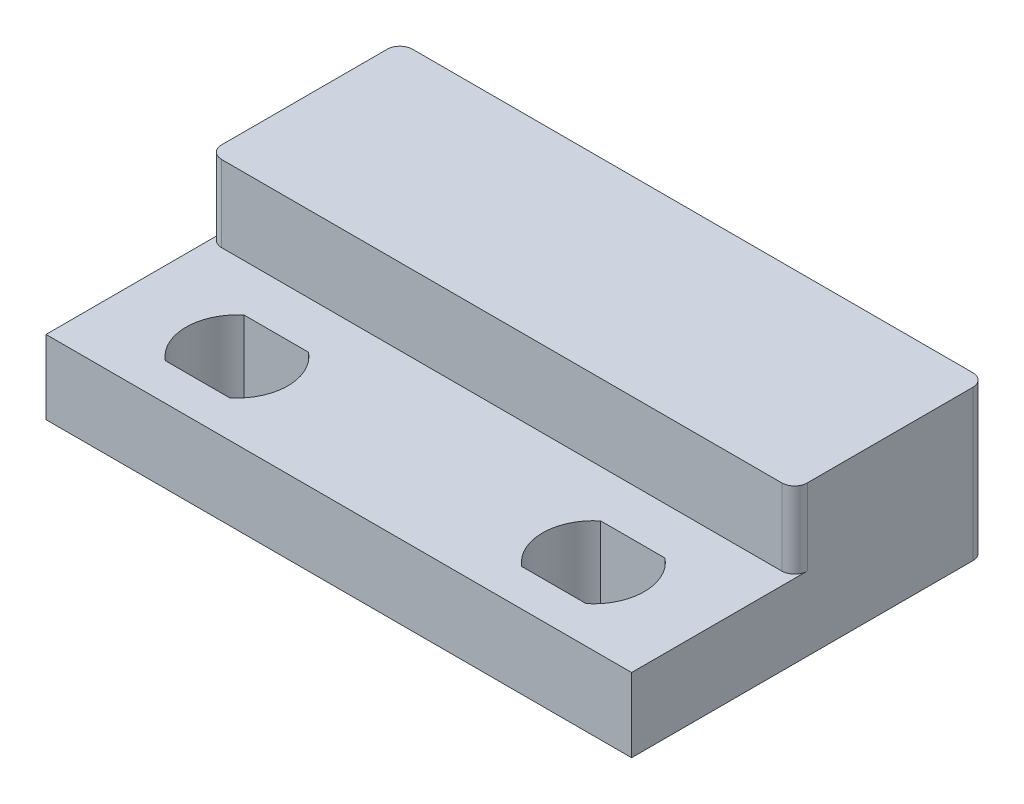
ISO-10303-21;
HEADER;
FILE_DESCRIPTION(('STEP AP214'),'2;1');
FILE_NAME('part.step','',(''),(''),'','','');
FILE_SCHEMA(('AUTOMOTIVE_DESIGN { 1 0 10303 214 1 1 1 1 }'));
ENDSEC;
DATA;
#1=APPLICATION_CONTEXT('core data for automotive mechanical design processes');
#2=APPLICATION_PROTOCOL_DEFINITION('international standard','automotive_design',2000,#1);
#3=PRODUCT_CONTEXT('',#1,'mechanical');
#4=PRODUCT('Part','Part','',(#3));
#5=PRODUCT_RELATED_PRODUCT_CATEGORY('part','',(#4));
#6=PRODUCT_DEFINITION_FORMATION('','',#4);
#7=PRODUCT_DEFINITION_CONTEXT('part definition',#1,'design');
#8=PRODUCT_DEFINITION('design','',#6,#7);
#9=PRODUCT_DEFINITION_SHAPE('','',#8);
#10=(LENGTH_UNIT() NAMED_UNIT(*) SI_UNIT(.MILLI.,.METRE.));
#11=(NAMED_UNIT(*) PLANE_ANGLE_UNIT() SI_UNIT($,.RADIAN.));
#12=(NAMED_UNIT(*) SI_UNIT($,.STERADIAN.) SOLID_ANGLE_UNIT());
#13=UNCERTAINTY_MEASURE_WITH_UNIT(LENGTH_MEASURE(1.E-05),#10,'distance_accuracy_value','');
#14=(GEOMETRIC_REPRESENTATION_CONTEXT(3) GLOBAL_UNCERTAINTY_ASSIGNED_CONTEXT((#13)) GLOBAL_UNIT_ASSIGNED_CONTEXT((#10,
#11,#12)) REPRESENTATION_CONTEXT('',''));
#15=CARTESIAN_POINT('',(0.,0.,0.));
#16=DIRECTION('',(0.,0.,1.));
#17=DIRECTION('',(1.,0.,0.));
#18=AXIS2_PLACEMENT_3D('',#15,#16,#17);
#19=CARTESIAN_POINT('',(11.5,1.45,10.15));
#20=DIRECTION('',(0.,0.,-1.));
#21=DIRECTION('',(-1.,0.,0.));
#22=AXIS2_PLACEMENT_3D('',#19,#20,#21);
#23=PLANE('',#22);
#24=DIRECTION('',(0.,-1.,0.));
#25=VECTOR('',#24,1.);
#26=CARTESIAN_POINT('',(-11.5,1.45,10.15));
#27=LINE('',#26,#25);
#28=CARTESIAN_POINT('',(-11.5,1.45,10.15));
#29=VERTEX_POINT('',#28);
#30=CARTESIAN_POINT('',(-11.5,-1.45,10.15));
#31=VERTEX_POINT('',#30);
#32=EDGE_CURVE('E215',#29,#31,#27,.T.);
#33=ORIENTED_EDGE('',*,*,#32,.T.);
#34=DIRECTION('',(-1.,0.,0.));
#35=VECTOR('',#34,1.);
#36=CARTESIAN_POINT('',(11.5,-1.45,10.15));
#37=LINE('',#36,#35);
#38=CARTESIAN_POINT('',(11.5,-1.45,10.15));
#39=VERTEX_POINT('',#38);
#40=EDGE_CURVE('E312',#39,#31,#37,.T.);
#41=ORIENTED_EDGE('',*,*,#40,.F.);
#42=DIRECTION('',(0.,-1.,0.));
#43=VECTOR('',#42,1.);
#44=CARTESIAN_POINT('',(11.5,1.45,10.15));
#45=LINE('',#44,#43);
#46=CARTESIAN_POINT('',(11.5,1.45,10.15));
#47=VERTEX_POINT('',#46);
#48=EDGE_CURVE('E264',#47,#39,#45,.T.);
#49=ORIENTED_EDGE('',*,*,#48,.F.);
#50=DIRECTION('',(-1.,0.,0.));
#51=VECTOR('',#50,1.);
#52=CARTESIAN_POINT('',(11.5,1.45,10.15));
#53=LINE('',#52,#51);
#54=EDGE_CURVE('E279',#47,#29,#53,.T.);
#55=ORIENTED_EDGE('',*,*,#54,.T.);
#56=EDGE_LOOP('',(#33,#41,#49,#55));
#57=FACE_BOUND('',#56,.T.);
#58=ADVANCED_FACE('F39',(#57),#23,.F.);
#59=CARTESIAN_POINT('',(11.5,-1.45,10.15));
#60=DIRECTION('',(0.,1.,0.));
#61=DIRECTION('',(0.,0.,1.));
#62=AXIS2_PLACEMENT_3D('',#59,#60,#61);
#63=PLANE('',#62);
#64=DIRECTION('',(1.,0.,0.));
#65=VECTOR('',#64,1.);
#66=CARTESIAN_POINT('',(-8.26392246597645,-1.45,8.7));
#67=LINE('',#66,#65);
#68=CARTESIAN_POINT('',(-8.26392246597645,-1.45,8.7));
#69=VERTEX_POINT('',#68);
#70=CARTESIAN_POINT('',(-5.73607753402354,-1.45,8.7));
#71=VERTEX_POINT('',#70);
#72=EDGE_CURVE('E177',#69,#71,#67,.T.);
#73=ORIENTED_EDGE('',*,*,#72,.T.);
#74=CARTESIAN_POINT('',(-7.,-1.45,7.15));
#75=DIRECTION('',(0.,1.,0.));
#76=DIRECTION('',(0.,0.,1.));
#77=AXIS2_PLACEMENT_3D('',#74,#75,#76);
#78=CIRCLE('',#77,2.);
#79=CARTESIAN_POINT('',(-5.73607753402355,-1.45,5.6));
#80=VERTEX_POINT('',#79);
#81=EDGE_CURVE('E168',#71,#80,#78,.T.);
#82=ORIENTED_EDGE('',*,*,#81,.T.);
#83=DIRECTION('',(-1.,0.,0.));
#84=VECTOR('',#83,1.);
#85=CARTESIAN_POINT('',(-8.26392246597645,-1.45,5.6));
#86=LINE('',#85,#84);
#87=CARTESIAN_POINT('',(-8.26392246597645,-1.45,5.6));
#88=VERTEX_POINT('',#87);
#89=EDGE_CURVE('E181',#80,#88,#86,.T.);
#90=ORIENTED_EDGE('',*,*,#89,.T.);
#91=CARTESIAN_POINT('',(-7.,-1.45,7.15));
#92=DIRECTION('',(0.,1.,0.));
#93=DIRECTION('',(0.,0.,1.));
#94=AXIS2_PLACEMENT_3D('',#91,#92,#93);
#95=CIRCLE('',#94,2.);
#96=EDGE_CURVE('E186',#88,#69,#95,.T.);
#97=ORIENTED_EDGE('',*,*,#96,.T.);
#98=EDGE_LOOP('',(#73,#82,#90,#97));
#99=FACE_BOUND('',#98,.T.);
#100=DIRECTION('',(1.,0.,0.));
#101=VECTOR('',#100,1.);
#102=CARTESIAN_POINT('',(5.73607753402355,-1.45,8.7));
#103=LINE('',#102,#101);
#104=CARTESIAN_POINT('',(5.73607753402355,-1.45,8.7));
#105=VERTEX_POINT('',#104);
#106=CARTESIAN_POINT('',(8.26392246597645,-1.45,8.7));
#107=VERTEX_POINT('',#106);
#108=EDGE_CURVE('E234',#105,#107,#103,.T.);
#109=ORIENTED_EDGE('',*,*,#108,.T.);
#110=CARTESIAN_POINT('',(7.,-1.45,7.15));
#111=DIRECTION('',(0.,1.,0.));
#112=DIRECTION('',(0.,0.,1.));
#113=AXIS2_PLACEMENT_3D('',#110,#111,#112);
#114=CIRCLE('',#113,2.);
#115=CARTESIAN_POINT('',(8.26392246597645,-1.45,5.6));
#116=VERTEX_POINT('',#115);
#117=EDGE_CURVE('E221',#107,#116,#114,.T.);
#118=ORIENTED_EDGE('',*,*,#117,.T.);
#119=DIRECTION('',(-1.,0.,0.));
#120=VECTOR('',#119,1.);
#121=CARTESIAN_POINT('',(5.73607753402355,-1.45,5.6));
#122=LINE('',#121,#120);
#123=CARTESIAN_POINT('',(5.73607753402355,-1.45,5.6));
#124=VERTEX_POINT('',#123);
#125=EDGE_CURVE('E225',#116,#124,#122,.T.);
#126=ORIENTED_EDGE('',*,*,#125,.T.);
#127=CARTESIAN_POINT('',(7.,-1.45,7.15));
#128=DIRECTION('',(0.,1.,0.));
#129=DIRECTION('',(0.,0.,1.));
#130=AXIS2_PLACEMENT_3D('',#127,#128,#129);
#131=CIRCLE('',#130,2.);
#132=EDGE_CURVE('E230',#124,#105,#131,.T.);
#133=ORIENTED_EDGE('',*,*,#132,.T.);
#134=EDGE_LOOP('',(#109,#118,#126,#133));
#135=FACE_BOUND('',#134,.T.);
#136=DIRECTION('',(-1.,0.,0.));
#137=VECTOR('',#136,1.);
#138=CARTESIAN_POINT('',(11.5,-1.45,-3.75));
#139=LINE('',#138,#137);
#140=CARTESIAN_POINT('',(11.,-1.45,-3.75));
#141=VERTEX_POINT('',#140);
#142=CARTESIAN_POINT('',(-11.,-1.45,-3.75));
#143=VERTEX_POINT('',#142);
#144=EDGE_CURVE('E308',#141,#143,#139,.T.);
#145=ORIENTED_EDGE('',*,*,#144,.F.);
#146=CARTESIAN_POINT('',(11.,-1.45,-3.25));
#147=DIRECTION('',(0.,1.,0.));
#148=DIRECTION('',(0.,0.,1.));
#149=AXIS2_PLACEMENT_3D('',#146,#147,#148);
#150=CIRCLE('',#149,0.5);
#151=CARTESIAN_POINT('',(11.5,-1.45,-3.25));
#152=VERTEX_POINT('',#151);
#153=EDGE_CURVE('E346',#141,#152,#150,.F.);
#154=ORIENTED_EDGE('',*,*,#153,.T.);
#155=DIRECTION('',(0.,0.,-1.));
#156=VECTOR('',#155,1.);
#157=CARTESIAN_POINT('',(11.5,-1.45,10.15));
#158=LINE('',#157,#156);
#159=EDGE_CURVE('E268',#39,#152,#158,.T.);
#160=ORIENTED_EDGE('',*,*,#159,.F.);
#161=ORIENTED_EDGE('',*,*,#40,.T.);
#162=DIRECTION('',(0.,0.,-1.));
#163=VECTOR('',#162,1.);
#164=CARTESIAN_POINT('',(-11.5,-1.45,10.15));
#165=LINE('',#164,#163);
#166=CARTESIAN_POINT('',(-11.5,-1.45,-3.25));
#167=VERTEX_POINT('',#166);
#168=EDGE_CURVE('E283',#31,#167,#165,.T.);
#169=ORIENTED_EDGE('',*,*,#168,.T.);
#170=CARTESIAN_POINT('',(-11.,-1.45,-3.25));
#171=DIRECTION('',(0.,1.,0.));
#172=DIRECTION('',(0.,0.,1.));
#173=AXIS2_PLACEMENT_3D('',#170,#171,#172);
#174=CIRCLE('',#173,0.5);
#175=EDGE_CURVE('E343',#167,#143,#174,.F.);
#176=ORIENTED_EDGE('',*,*,#175,.T.);
#177=EDGE_LOOP('',(#145,#154,#160,#161,#169,#176));
#178=FACE_BOUND('',#177,.T.);
#179=ADVANCED_FACE('F188',(#99,#135,#178),#63,.F.);
#180=CARTESIAN_POINT('',(11.5,-1.45,-3.75));
#181=DIRECTION('',(0.,0.,1.));
#182=DIRECTION('',(1.,0.,0.));
#183=AXIS2_PLACEMENT_3D('',#180,#181,#182);
#184=PLANE('',#183);
#185=DIRECTION('',(-1.,0.,0.));
#186=VECTOR('',#185,1.);
#187=CARTESIAN_POINT('',(11.5,4.45,-3.75));
#188=LINE('',#187,#186);
#189=CARTESIAN_POINT('',(11.,4.45,-3.75));
#190=VERTEX_POINT('',#189);
#191=CARTESIAN_POINT('',(-11.,4.45,-3.75));
#192=VERTEX_POINT('',#191);
#193=EDGE_CURVE('E304',#190,#192,#188,.T.);
#194=ORIENTED_EDGE('',*,*,#193,.F.);
#195=DIRECTION('',(0.,1.,0.));
#196=VECTOR('',#195,1.);
#197=CARTESIAN_POINT('',(11.,-1.45,-3.75));
#198=LINE('',#197,#196);
#199=EDGE_CURVE('E340',#190,#141,#198,.F.);
#200=ORIENTED_EDGE('',*,*,#199,.T.);
#201=ORIENTED_EDGE('',*,*,#144,.T.);
#202=DIRECTION('',(0.,1.,0.));
#203=VECTOR('',#202,1.);
#204=CARTESIAN_POINT('',(-11.,-1.45,-3.75));
#205=LINE('',#204,#203);
#206=EDGE_CURVE('E336',#143,#192,#205,.T.);
#207=ORIENTED_EDGE('',*,*,#206,.T.);
#208=EDGE_LOOP('',(#194,#200,#201,#207));
#209=FACE_BOUND('',#208,.T.);
#210=ADVANCED_FACE('F386',(#209),#184,.F.);
#211=CARTESIAN_POINT('',(11.5,4.45,-3.75));
#212=DIRECTION('',(0.,-1.,0.));
#213=DIRECTION('',(0.,0.,-1.));
#214=AXIS2_PLACEMENT_3D('',#211,#212,#213);
#215=PLANE('',#214);
#216=DIRECTION('',(0.,0.,1.));
#217=VECTOR('',#216,1.);
#218=CARTESIAN_POINT('',(11.5,4.45,-3.75));
#219=LINE('',#218,#217);
#220=CARTESIAN_POINT('',(11.5,4.45,-3.25));
#221=VERTEX_POINT('',#220);
#222=CARTESIAN_POINT('',(11.5,4.45,3.25));
#223=VERTEX_POINT('',#222);
#224=EDGE_CURVE('E272',#221,#223,#219,.T.);
#225=ORIENTED_EDGE('',*,*,#224,.F.);
#226=CARTESIAN_POINT('',(11.,4.45,-3.25));
#227=DIRECTION('',(0.,-1.,0.));
#228=DIRECTION('',(0.,0.,-1.));
#229=AXIS2_PLACEMENT_3D('',#226,#227,#228);
#230=CIRCLE('',#229,0.5);
#231=EDGE_CURVE('E333',#221,#190,#230,.F.);
#232=ORIENTED_EDGE('',*,*,#231,.T.);
#233=ORIENTED_EDGE('',*,*,#193,.T.);
#234=CARTESIAN_POINT('',(-11.,4.45,-3.25));
#235=DIRECTION('',(0.,-1.,0.));
#236=DIRECTION('',(0.,0.,-1.));
#237=AXIS2_PLACEMENT_3D('',#234,#235,#236);
#238=CIRCLE('',#237,0.5);
#239=CARTESIAN_POINT('',(-11.5,4.45,-3.25));
#240=VERTEX_POINT('',#239);
#241=EDGE_CURVE('E327',#192,#240,#238,.F.);
#242=ORIENTED_EDGE('',*,*,#241,.T.);
#243=DIRECTION('',(0.,0.,1.));
#244=VECTOR('',#243,1.);
#245=CARTESIAN_POINT('',(-11.5,4.45,-3.75));
#246=LINE('',#245,#244);
#247=CARTESIAN_POINT('',(-11.5,4.45,3.25));
#248=VERTEX_POINT('',#247);
#249=EDGE_CURVE('E287',#240,#248,#246,.T.);
#250=ORIENTED_EDGE('',*,*,#249,.T.);
#251=CARTESIAN_POINT('',(-11.,4.45,3.25));
#252=DIRECTION('',(0.,-1.,0.));
#253=DIRECTION('',(0.,0.,-1.));
#254=AXIS2_PLACEMENT_3D('',#251,#252,#253);
#255=CIRCLE('',#254,0.5);
#256=CARTESIAN_POINT('',(-11.,4.45,3.75));
#257=VERTEX_POINT('',#256);
#258=EDGE_CURVE('E324',#248,#257,#255,.F.);
#259=ORIENTED_EDGE('',*,*,#258,.T.);
#260=DIRECTION('',(-1.,0.,0.));
#261=VECTOR('',#260,1.);
#262=CARTESIAN_POINT('',(11.5,4.45,3.75));
#263=LINE('',#262,#261);
#264=CARTESIAN_POINT('',(11.,4.45,3.75));
#265=VERTEX_POINT('',#264);
#266=EDGE_CURVE('E300',#265,#257,#263,.T.);
#267=ORIENTED_EDGE('',*,*,#266,.F.);
#268=CARTESIAN_POINT('',(11.,4.45,3.25));
#269=DIRECTION('',(0.,-1.,0.));
#270=DIRECTION('',(0.,0.,-1.));
#271=AXIS2_PLACEMENT_3D('',#268,#269,#270);
#272=CIRCLE('',#271,0.5);
#273=EDGE_CURVE('E330',#265,#223,#272,.F.);
#274=ORIENTED_EDGE('',*,*,#273,.T.);
#275=EDGE_LOOP('',(#225,#232,#233,#242,#250,#259,#267,#274));
#276=FACE_BOUND('',#275,.T.);
#277=ADVANCED_FACE('F376',(#276),#215,.F.);
#278=CARTESIAN_POINT('',(11.5,4.45,3.75));
#279=DIRECTION('',(0.,0.,-1.));
#280=DIRECTION('',(-1.,0.,0.));
#281=AXIS2_PLACEMENT_3D('',#278,#279,#280);
#282=PLANE('',#281);
#283=DIRECTION('',(-1.,0.,0.));
#284=VECTOR('',#283,1.);
#285=CARTESIAN_POINT('',(11.5,1.45,3.75));
#286=LINE('',#285,#284);
#287=CARTESIAN_POINT('',(11.,1.45,3.75));
#288=VERTEX_POINT('',#287);
#289=CARTESIAN_POINT('',(-11.,1.45,3.75));
#290=VERTEX_POINT('',#289);
#291=EDGE_CURVE('E296',#288,#290,#286,.T.);
#292=ORIENTED_EDGE('',*,*,#291,.F.);
#293=DIRECTION('',(0.,-1.,0.));
#294=VECTOR('',#293,1.);
#295=CARTESIAN_POINT('',(11.,4.45,3.75));
#296=LINE('',#295,#294);
#297=EDGE_CURVE('E352',#288,#265,#296,.F.);
#298=ORIENTED_EDGE('',*,*,#297,.T.);
#299=ORIENTED_EDGE('',*,*,#266,.T.);
#300=DIRECTION('',(0.,-1.,0.));
#301=VECTOR('',#300,1.);
#302=CARTESIAN_POINT('',(-11.,4.45,3.75));
#303=LINE('',#302,#301);
#304=EDGE_CURVE('E349',#257,#290,#303,.T.);
#305=ORIENTED_EDGE('',*,*,#304,.T.);
#306=EDGE_LOOP('',(#292,#298,#299,#305));
#307=FACE_BOUND('',#306,.T.);
#308=ADVANCED_FACE('F370',(#307),#282,.F.);
#309=CARTESIAN_POINT('',(11.5,1.45,3.75));
#310=DIRECTION('',(0.,-1.,0.));
#311=DIRECTION('',(0.,0.,-1.));
#312=AXIS2_PLACEMENT_3D('',#309,#310,#311);
#313=PLANE('',#312);
#314=DIRECTION('',(-1.,0.,0.));
#315=VECTOR('',#314,1.);
#316=CARTESIAN_POINT('',(-8.26392246597645,1.45,5.6));
#317=LINE('',#316,#315);
#318=CARTESIAN_POINT('',(-5.73607753402355,1.45,5.6));
#319=VERTEX_POINT('',#318);
#320=CARTESIAN_POINT('',(-8.26392246597645,1.45,5.6));
#321=VERTEX_POINT('',#320);
#322=EDGE_CURVE('E205',#319,#321,#317,.T.);
#323=ORIENTED_EDGE('',*,*,#322,.F.);
#324=CARTESIAN_POINT('',(-7.,1.45,7.15));
#325=DIRECTION('',(0.,1.,0.));
#326=DIRECTION('',(0.,0.,1.));
#327=AXIS2_PLACEMENT_3D('',#324,#325,#326);
#328=CIRCLE('',#327,2.);
#329=CARTESIAN_POINT('',(-5.73607753402354,1.45,8.7));
#330=VERTEX_POINT('',#329);
#331=EDGE_CURVE('E171',#330,#319,#328,.T.);
#332=ORIENTED_EDGE('',*,*,#331,.F.);
#333=DIRECTION('',(1.,0.,0.));
#334=VECTOR('',#333,1.);
#335=CARTESIAN_POINT('',(-8.26392246597645,1.45,8.7));
#336=LINE('',#335,#334);
#337=CARTESIAN_POINT('',(-8.26392246597645,1.45,8.7));
#338=VERTEX_POINT('',#337);
#339=EDGE_CURVE('E192',#338,#330,#336,.T.);
#340=ORIENTED_EDGE('',*,*,#339,.F.);
#341=CARTESIAN_POINT('',(-7.,1.45,7.15));
#342=DIRECTION('',(0.,1.,0.));
#343=DIRECTION('',(0.,0.,1.));
#344=AXIS2_PLACEMENT_3D('',#341,#342,#343);
#345=CIRCLE('',#344,2.);
#346=EDGE_CURVE('E196',#321,#338,#345,.T.);
#347=ORIENTED_EDGE('',*,*,#346,.F.);
#348=EDGE_LOOP('',(#323,#332,#340,#347));
#349=FACE_BOUND('',#348,.T.);
#350=DIRECTION('',(-1.,0.,0.));
#351=VECTOR('',#350,1.);
#352=CARTESIAN_POINT('',(5.73607753402355,1.45,5.6));
#353=LINE('',#352,#351);
#354=CARTESIAN_POINT('',(8.26392246597645,1.45,5.6));
#355=VERTEX_POINT('',#354);
#356=CARTESIAN_POINT('',(5.73607753402355,1.45,5.6));
#357=VERTEX_POINT('',#356);
#358=EDGE_CURVE('E242',#355,#357,#353,.T.);
#359=ORIENTED_EDGE('',*,*,#358,.F.);
#360=CARTESIAN_POINT('',(7.,1.45,7.15));
#361=DIRECTION('',(0.,1.,0.));
#362=DIRECTION('',(0.,0.,1.));
#363=AXIS2_PLACEMENT_3D('',#360,#361,#362);
#364=CIRCLE('',#363,2.);
#365=CARTESIAN_POINT('',(8.26392246597645,1.45,8.7));
#366=VERTEX_POINT('',#365);
#367=EDGE_CURVE('E239',#366,#355,#364,.T.);
#368=ORIENTED_EDGE('',*,*,#367,.F.);
#369=DIRECTION('',(1.,0.,0.));
#370=VECTOR('',#369,1.);
#371=CARTESIAN_POINT('',(5.73607753402355,1.45,8.7));
#372=LINE('',#371,#370);
#373=CARTESIAN_POINT('',(5.73607753402355,1.45,8.7));
#374=VERTEX_POINT('',#373);
#375=EDGE_CURVE('E226',#374,#366,#372,.T.);
#376=ORIENTED_EDGE('',*,*,#375,.F.);
#377=CARTESIAN_POINT('',(7.,1.45,7.15));
#378=DIRECTION('',(0.,1.,0.));
#379=DIRECTION('',(0.,0.,1.));
#380=AXIS2_PLACEMENT_3D('',#377,#378,#379);
#381=CIRCLE('',#380,2.);
#382=EDGE_CURVE('E246',#357,#374,#381,.T.);
#383=ORIENTED_EDGE('',*,*,#382,.F.);
#384=EDGE_LOOP('',(#359,#368,#376,#383));
#385=FACE_BOUND('',#384,.T.);
#386=DIRECTION('',(0.,0.,1.));
#387=VECTOR('',#386,1.);
#388=CARTESIAN_POINT('',(-11.5,1.45,3.75));
#389=LINE('',#388,#387);
#390=CARTESIAN_POINT('',(-11.5,1.45,3.25));
#391=VERTEX_POINT('',#390);
#392=EDGE_CURVE('E55',#391,#29,#389,.T.);
#393=ORIENTED_EDGE('',*,*,#392,.T.);
#394=ORIENTED_EDGE('',*,*,#54,.F.);
#395=DIRECTION('',(0.,0.,1.));
#396=VECTOR('',#395,1.);
#397=CARTESIAN_POINT('',(11.5,1.45,3.75));
#398=LINE('',#397,#396);
#399=CARTESIAN_POINT('',(11.5,1.45,3.25));
#400=VERTEX_POINT('',#399);
#401=EDGE_CURVE('E276',#400,#47,#398,.T.);
#402=ORIENTED_EDGE('',*,*,#401,.F.);
#403=CARTESIAN_POINT('',(11.,1.45,3.25));
#404=DIRECTION('',(0.,-1.,0.));
#405=DIRECTION('',(0.,0.,-1.));
#406=AXIS2_PLACEMENT_3D('',#403,#404,#405);
#407=CIRCLE('',#406,0.5);
#408=EDGE_CURVE('E48',#400,#288,#407,.T.);
#409=ORIENTED_EDGE('',*,*,#408,.T.);
#410=ORIENTED_EDGE('',*,*,#291,.T.);
#411=CARTESIAN_POINT('',(-11.,1.45,3.25));
#412=DIRECTION('',(0.,-1.,0.));
#413=DIRECTION('',(0.,0.,-1.));
#414=AXIS2_PLACEMENT_3D('',#411,#412,#413);
#415=CIRCLE('',#414,0.5);
#416=EDGE_CURVE('E11',#290,#391,#415,.T.);
#417=ORIENTED_EDGE('',*,*,#416,.T.);
#418=EDGE_LOOP('',(#393,#394,#402,#409,#410,#417));
#419=FACE_BOUND('',#418,.T.);
#420=ADVANCED_FACE('F364',(#349,#385,#419),#313,.F.);
#421=CARTESIAN_POINT('',(11.5,0.,0.));
#422=DIRECTION('',(1.,0.,0.));
#423=DIRECTION('',(0.,0.,-1.));
#424=AXIS2_PLACEMENT_3D('',#421,#422,#423);
#425=PLANE('',#424);
#426=ORIENTED_EDGE('',*,*,#159,.T.);
#427=DIRECTION('',(0.,1.,0.));
#428=VECTOR('',#427,1.);
#429=CARTESIAN_POINT('',(11.5,4.45,-3.25));
#430=LINE('',#429,#428);
#431=EDGE_CURVE('E320',#152,#221,#430,.T.);
#432=ORIENTED_EDGE('',*,*,#431,.T.);
#433=ORIENTED_EDGE('',*,*,#224,.T.);
#434=DIRECTION('',(0.,-1.,0.));
#435=VECTOR('',#434,1.);
#436=CARTESIAN_POINT('',(11.5,1.45,3.25));
#437=LINE('',#436,#435);
#438=EDGE_CURVE('E316',#223,#400,#437,.T.);
#439=ORIENTED_EDGE('',*,*,#438,.T.);
#440=ORIENTED_EDGE('',*,*,#401,.T.);
#441=ORIENTED_EDGE('',*,*,#48,.T.);
#442=EDGE_LOOP('',(#426,#432,#433,#439,#440,#441));
#443=FACE_BOUND('',#442,.T.);
#444=ADVANCED_FACE('F378',(#443),#425,.T.);
#445=CARTESIAN_POINT('',(-11.5,0.,0.));
#446=DIRECTION('',(1.,0.,0.));
#447=DIRECTION('',(0.,0.,-1.));
#448=AXIS2_PLACEMENT_3D('',#445,#446,#447);
#449=PLANE('',#448);
#450=ORIENTED_EDGE('',*,*,#249,.F.);
#451=DIRECTION('',(0.,1.,0.));
#452=VECTOR('',#451,1.);
#453=CARTESIAN_POINT('',(-11.5,0.,-3.25));
#454=LINE('',#453,#452);
#455=EDGE_CURVE('E358',#240,#167,#454,.F.);
#456=ORIENTED_EDGE('',*,*,#455,.T.);
#457=ORIENTED_EDGE('',*,*,#168,.F.);
#458=ORIENTED_EDGE('',*,*,#32,.F.);
#459=ORIENTED_EDGE('',*,*,#392,.F.);
#460=DIRECTION('',(0.,-1.,0.));
#461=VECTOR('',#460,1.);
#462=CARTESIAN_POINT('',(-11.5,0.,3.25));
#463=LINE('',#462,#461);
#464=EDGE_CURVE('E355',#391,#248,#463,.F.);
#465=ORIENTED_EDGE('',*,*,#464,.T.);
#466=EDGE_LOOP('',(#450,#456,#457,#458,#459,#465));
#467=FACE_BOUND('',#466,.T.);
#468=ADVANCED_FACE('F395',(#467),#449,.F.);
#469=CARTESIAN_POINT('',(7.,-1.45,7.15));
#470=DIRECTION('',(0.,1.,0.));
#471=DIRECTION('',(0.,0.,1.));
#472=AXIS2_PLACEMENT_3D('',#469,#470,#471);
#473=CYLINDRICAL_SURFACE('',#472,2.);
#474=ORIENTED_EDGE('',*,*,#367,.T.);
#475=DIRECTION('',(0.,1.,0.));
#476=VECTOR('',#475,1.);
#477=CARTESIAN_POINT('',(8.26392246597645,-1.45,5.6));
#478=LINE('',#477,#476);
#479=EDGE_CURVE('E238',#116,#355,#478,.T.);
#480=ORIENTED_EDGE('',*,*,#479,.F.);
#481=ORIENTED_EDGE('',*,*,#117,.F.);
#482=DIRECTION('',(0.,1.,0.));
#483=VECTOR('',#482,1.);
#484=CARTESIAN_POINT('',(8.26392246597645,-1.45,8.7));
#485=LINE('',#484,#483);
#486=EDGE_CURVE('E206',#107,#366,#485,.T.);
#487=ORIENTED_EDGE('',*,*,#486,.T.);
#488=EDGE_LOOP('',(#474,#480,#481,#487));
#489=FACE_BOUND('',#488,.T.);
#490=ADVANCED_FACE('F493',(#489),#473,.F.);
#491=CARTESIAN_POINT('',(5.73607753402355,-1.45,8.7));
#492=DIRECTION('',(0.,0.,1.));
#493=DIRECTION('',(1.,0.,0.));
#494=AXIS2_PLACEMENT_3D('',#491,#492,#493);
#495=PLANE('',#494);
#496=ORIENTED_EDGE('',*,*,#375,.T.);
#497=ORIENTED_EDGE('',*,*,#486,.F.);
#498=ORIENTED_EDGE('',*,*,#108,.F.);
#499=DIRECTION('',(0.,1.,0.));
#500=VECTOR('',#499,1.);
#501=CARTESIAN_POINT('',(5.73607753402355,-1.45,8.7));
#502=LINE('',#501,#500);
#503=EDGE_CURVE('E255',#105,#374,#502,.T.);
#504=ORIENTED_EDGE('',*,*,#503,.T.);
#505=EDGE_LOOP('',(#496,#497,#498,#504));
#506=FACE_BOUND('',#505,.T.);
#507=ADVANCED_FACE('F484',(#506),#495,.F.);
#508=CARTESIAN_POINT('',(7.,-1.45,7.15));
#509=DIRECTION('',(0.,1.,0.));
#510=DIRECTION('',(0.,0.,1.));
#511=AXIS2_PLACEMENT_3D('',#508,#509,#510);
#512=CYLINDRICAL_SURFACE('',#511,2.);
#513=ORIENTED_EDGE('',*,*,#382,.T.);
#514=ORIENTED_EDGE('',*,*,#503,.F.);
#515=ORIENTED_EDGE('',*,*,#132,.F.);
#516=DIRECTION('',(0.,1.,0.));
#517=VECTOR('',#516,1.);
#518=CARTESIAN_POINT('',(5.73607753402355,-1.45,5.6));
#519=LINE('',#518,#517);
#520=EDGE_CURVE('E258',#124,#357,#519,.T.);
#521=ORIENTED_EDGE('',*,*,#520,.T.);
#522=EDGE_LOOP('',(#513,#514,#515,#521));
#523=FACE_BOUND('',#522,.T.);
#524=ADVANCED_FACE('F475',(#523),#512,.F.);
#525=CARTESIAN_POINT('',(5.73607753402355,-1.45,5.6));
#526=DIRECTION('',(0.,0.,-1.));
#527=DIRECTION('',(-1.,0.,0.));
#528=AXIS2_PLACEMENT_3D('',#525,#526,#527);
#529=PLANE('',#528);
#530=ORIENTED_EDGE('',*,*,#358,.T.);
#531=ORIENTED_EDGE('',*,*,#520,.F.);
#532=ORIENTED_EDGE('',*,*,#125,.F.);
#533=ORIENTED_EDGE('',*,*,#479,.T.);
#534=EDGE_LOOP('',(#530,#531,#532,#533));
#535=FACE_BOUND('',#534,.T.);
#536=ADVANCED_FACE('F467',(#535),#529,.F.);
#537=CARTESIAN_POINT('',(-7.,-1.45,7.15));
#538=DIRECTION('',(0.,1.,0.));
#539=DIRECTION('',(0.,0.,1.));
#540=AXIS2_PLACEMENT_3D('',#537,#538,#539);
#541=CYLINDRICAL_SURFACE('',#540,2.);
#542=ORIENTED_EDGE('',*,*,#331,.T.);
#543=DIRECTION('',(0.,1.,0.));
#544=VECTOR('',#543,1.);
#545=CARTESIAN_POINT('',(-5.73607753402355,-1.45,5.6));
#546=LINE('',#545,#544);
#547=EDGE_CURVE('E164',#80,#319,#546,.T.);
#548=ORIENTED_EDGE('',*,*,#547,.F.);
#549=ORIENTED_EDGE('',*,*,#81,.F.);
#550=DIRECTION('',(0.,1.,0.));
#551=VECTOR('',#550,1.);
#552=CARTESIAN_POINT('',(-5.73607753402354,-1.45,8.7));
#553=LINE('',#552,#551);
#554=EDGE_CURVE('E212',#71,#330,#553,.T.);
#555=ORIENTED_EDGE('',*,*,#554,.T.);
#556=EDGE_LOOP('',(#542,#548,#549,#555));
#557=FACE_BOUND('',#556,.T.);
#558=ADVANCED_FACE('F166',(#557),#541,.F.);
#559=CARTESIAN_POINT('',(-8.26392246597645,-1.45,8.7));
#560=DIRECTION('',(0.,0.,1.));
#561=DIRECTION('',(0.,-1.,0.));
#562=AXIS2_PLACEMENT_3D('',#559,#560,#561);
#563=PLANE('',#562);
#564=ORIENTED_EDGE('',*,*,#339,.T.);
#565=ORIENTED_EDGE('',*,*,#554,.F.);
#566=ORIENTED_EDGE('',*,*,#72,.F.);
#567=DIRECTION('',(0.,1.,0.));
#568=VECTOR('',#567,1.);
#569=CARTESIAN_POINT('',(-8.26392246597645,-1.45,8.7));
#570=LINE('',#569,#568);
#571=EDGE_CURVE('E216',#69,#338,#570,.T.);
#572=ORIENTED_EDGE('',*,*,#571,.T.);
#573=EDGE_LOOP('',(#564,#565,#566,#572));
#574=FACE_BOUND('',#573,.T.);
#575=ADVANCED_FACE('F450',(#574),#563,.F.);
#576=CARTESIAN_POINT('',(-7.,-1.45,7.15));
#577=DIRECTION('',(0.,1.,0.));
#578=DIRECTION('',(0.,0.,1.));
#579=AXIS2_PLACEMENT_3D('',#576,#577,#578);
#580=CYLINDRICAL_SURFACE('',#579,2.);
#581=ORIENTED_EDGE('',*,*,#346,.T.);
#582=ORIENTED_EDGE('',*,*,#571,.F.);
#583=ORIENTED_EDGE('',*,*,#96,.F.);
#584=DIRECTION('',(0.,1.,0.));
#585=VECTOR('',#584,1.);
#586=CARTESIAN_POINT('',(-8.26392246597645,-1.45,5.6));
#587=LINE('',#586,#585);
#588=EDGE_CURVE('E176',#88,#321,#587,.T.);
#589=ORIENTED_EDGE('',*,*,#588,.T.);
#590=EDGE_LOOP('',(#581,#582,#583,#589));
#591=FACE_BOUND('',#590,.T.);
#592=ADVANCED_FACE('F441',(#591),#580,.F.);
#593=CARTESIAN_POINT('',(-8.26392246597645,-1.45,5.6));
#594=DIRECTION('',(0.,0.,-1.));
#595=DIRECTION('',(-1.,0.,0.));
#596=AXIS2_PLACEMENT_3D('',#593,#594,#595);
#597=PLANE('',#596);
#598=ORIENTED_EDGE('',*,*,#322,.T.);
#599=ORIENTED_EDGE('',*,*,#588,.F.);
#600=ORIENTED_EDGE('',*,*,#89,.F.);
#601=ORIENTED_EDGE('',*,*,#547,.T.);
#602=EDGE_LOOP('',(#598,#599,#600,#601));
#603=FACE_BOUND('',#602,.T.);
#604=ADVANCED_FACE('F182',(#603),#597,.F.);
#605=CARTESIAN_POINT('',(11.,0.,-3.25));
#606=DIRECTION('',(0.,-1.,0.));
#607=DIRECTION('',(0.,0.,-1.));
#608=AXIS2_PLACEMENT_3D('',#605,#606,#607);
#609=CYLINDRICAL_SURFACE('',#608,0.5);
#610=ORIENTED_EDGE('',*,*,#153,.F.);
#611=ORIENTED_EDGE('',*,*,#199,.F.);
#612=ORIENTED_EDGE('',*,*,#231,.F.);
#613=ORIENTED_EDGE('',*,*,#431,.F.);
#614=EDGE_LOOP('',(#610,#611,#612,#613));
#615=FACE_BOUND('',#614,.T.);
#616=ADVANCED_FACE('F382',(#615),#609,.T.);
#617=CARTESIAN_POINT('',(11.,0.,3.25));
#618=DIRECTION('',(0.,1.,0.));
#619=DIRECTION('',(0.,0.,1.));
#620=AXIS2_PLACEMENT_3D('',#617,#618,#619);
#621=CYLINDRICAL_SURFACE('',#620,0.5);
#622=ORIENTED_EDGE('',*,*,#273,.F.);
#623=ORIENTED_EDGE('',*,*,#297,.F.);
#624=ORIENTED_EDGE('',*,*,#408,.F.);
#625=ORIENTED_EDGE('',*,*,#438,.F.);
#626=EDGE_LOOP('',(#622,#623,#624,#625));
#627=FACE_BOUND('',#626,.T.);
#628=ADVANCED_FACE('F373',(#627),#621,.T.);
#629=CARTESIAN_POINT('',(-11.,-1.45,-3.25));
#630=DIRECTION('',(0.,1.,0.));
#631=DIRECTION('',(0.,0.,1.));
#632=AXIS2_PLACEMENT_3D('',#629,#630,#631);
#633=CYLINDRICAL_SURFACE('',#632,0.5);
#634=ORIENTED_EDGE('',*,*,#175,.F.);
#635=ORIENTED_EDGE('',*,*,#455,.F.);
#636=ORIENTED_EDGE('',*,*,#241,.F.);
#637=ORIENTED_EDGE('',*,*,#206,.F.);
#638=EDGE_LOOP('',(#634,#635,#636,#637));
#639=FACE_BOUND('',#638,.T.);
#640=ADVANCED_FACE('F391',(#639),#633,.T.);
#641=CARTESIAN_POINT('',(-11.,4.45,3.25));
#642=DIRECTION('',(0.,-1.,0.));
#643=DIRECTION('',(0.,0.,-1.));
#644=AXIS2_PLACEMENT_3D('',#641,#642,#643);
#645=CYLINDRICAL_SURFACE('',#644,0.5);
#646=ORIENTED_EDGE('',*,*,#258,.F.);
#647=ORIENTED_EDGE('',*,*,#464,.F.);
#648=ORIENTED_EDGE('',*,*,#416,.F.);
#649=ORIENTED_EDGE('',*,*,#304,.F.);
#650=EDGE_LOOP('',(#646,#647,#648,#649));
#651=FACE_BOUND('',#650,.T.);
#652=ADVANCED_FACE('F41',(#651),#645,.T.);
#653=CLOSED_SHELL('',(#58,#179,#210,#277,#308,#420,#444,#468,#490,#507,#524,#536,#558,#575,#592,
#604,#616,#628,#640,#652));
#654=MANIFOLD_SOLID_BREP('B2',#653);
#655=ADVANCED_BREP_SHAPE_REPRESENTATION('',(#18,#654),#14);
#656=SHAPE_DEFINITION_REPRESENTATION(#9,#655);
ENDSEC;
END-ISO-10303-21;
